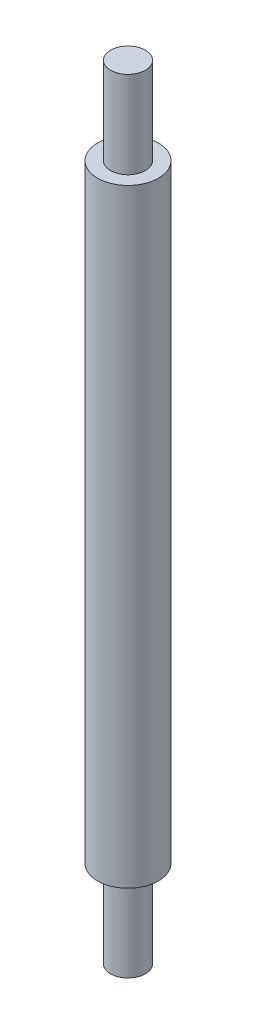
ISO-10303-21;
HEADER;
FILE_DESCRIPTION(('STEP AP214'),'2;1');
FILE_NAME('part.step','',(''),(''),'','','');
FILE_SCHEMA(('AUTOMOTIVE_DESIGN { 1 0 10303 214 1 1 1 1 }'));
ENDSEC;
DATA;
#1=APPLICATION_CONTEXT('core data for automotive mechanical design processes');
#2=APPLICATION_PROTOCOL_DEFINITION('international standard','automotive_design',2000,#1);
#3=PRODUCT_CONTEXT('',#1,'mechanical');
#4=PRODUCT('Part','Part','',(#3));
#5=PRODUCT_RELATED_PRODUCT_CATEGORY('part','',(#4));
#6=PRODUCT_DEFINITION_FORMATION('','',#4);
#7=PRODUCT_DEFINITION_CONTEXT('part definition',#1,'design');
#8=PRODUCT_DEFINITION('design','',#6,#7);
#9=PRODUCT_DEFINITION_SHAPE('','',#8);
#10=(LENGTH_UNIT() NAMED_UNIT(*) SI_UNIT(.MILLI.,.METRE.));
#11=(NAMED_UNIT(*) PLANE_ANGLE_UNIT() SI_UNIT($,.RADIAN.));
#12=(NAMED_UNIT(*) SI_UNIT($,.STERADIAN.) SOLID_ANGLE_UNIT());
#13=UNCERTAINTY_MEASURE_WITH_UNIT(LENGTH_MEASURE(1.E-05),#10,'distance_accuracy_value','');
#14=(GEOMETRIC_REPRESENTATION_CONTEXT(3) GLOBAL_UNCERTAINTY_ASSIGNED_CONTEXT((#13)) GLOBAL_UNIT_ASSIGNED_CONTEXT((#10,
#11,#12)) REPRESENTATION_CONTEXT('',''));
#15=CARTESIAN_POINT('',(0.,0.,0.));
#16=DIRECTION('',(0.,0.,1.));
#17=DIRECTION('',(1.,0.,0.));
#18=AXIS2_PLACEMENT_3D('',#15,#16,#17);
#19=CARTESIAN_POINT('',(0.,0.,0.));
#20=DIRECTION('',(0.,1.,0.));
#21=DIRECTION('',(0.,0.,1.));
#22=AXIS2_PLACEMENT_3D('',#19,#20,#21);
#23=PLANE('',#22);
#24=CARTESIAN_POINT('',(0.,0.,0.));
#25=DIRECTION('',(0.,1.,0.));
#26=DIRECTION('',(0.,0.,1.));
#27=AXIS2_PLACEMENT_3D('',#24,#25,#26);
#28=CIRCLE('',#27,3.5);
#29=CARTESIAN_POINT('',(0.,0.,3.5));
#30=VERTEX_POINT('',#29);
#31=EDGE_CURVE('E42',#30,#30,#28,.T.);
#32=ORIENTED_EDGE('',*,*,#31,.F.);
#33=EDGE_LOOP('',(#32));
#34=FACE_BOUND('',#33,.T.);
#35=CARTESIAN_POINT('',(0.,0.,0.));
#36=DIRECTION('',(0.,1.,0.));
#37=DIRECTION('',(0.,0.,1.));
#38=AXIS2_PLACEMENT_3D('',#35,#36,#37);
#39=CIRCLE('',#38,2.);
#40=CARTESIAN_POINT('',(0.,0.,2.));
#41=VERTEX_POINT('',#40);
#42=EDGE_CURVE('E10',#41,#41,#39,.F.);
#43=ORIENTED_EDGE('',*,*,#42,.F.);
#44=EDGE_LOOP('',(#43));
#45=FACE_BOUND('',#44,.T.);
#46=ADVANCED_FACE('F31',(#34,#45),#23,.F.);
#47=CARTESIAN_POINT('',(0.,70.,0.));
#48=DIRECTION('',(0.,1.,0.));
#49=DIRECTION('',(0.,0.,1.));
#50=AXIS2_PLACEMENT_3D('',#47,#48,#49);
#51=PLANE('',#50);
#52=CARTESIAN_POINT('',(0.,70.,0.));
#53=DIRECTION('',(0.,1.,0.));
#54=DIRECTION('',(0.,0.,1.));
#55=AXIS2_PLACEMENT_3D('',#52,#53,#54);
#56=CIRCLE('',#55,3.5);
#57=CARTESIAN_POINT('',(0.,70.,3.5));
#58=VERTEX_POINT('',#57);
#59=EDGE_CURVE('E38',#58,#58,#56,.T.);
#60=ORIENTED_EDGE('',*,*,#59,.T.);
#61=EDGE_LOOP('',(#60));
#62=FACE_BOUND('',#61,.T.);
#63=CARTESIAN_POINT('',(0.,70.,0.));
#64=DIRECTION('',(0.,1.,0.));
#65=DIRECTION('',(0.,0.,1.));
#66=AXIS2_PLACEMENT_3D('',#63,#64,#65);
#67=CIRCLE('',#66,2.);
#68=CARTESIAN_POINT('',(0.,70.,2.));
#69=VERTEX_POINT('',#68);
#70=EDGE_CURVE('E49',#69,#69,#67,.T.);
#71=ORIENTED_EDGE('',*,*,#70,.F.);
#72=EDGE_LOOP('',(#71));
#73=FACE_BOUND('',#72,.T.);
#74=ADVANCED_FACE('F73',(#62,#73),#51,.T.);
#75=CARTESIAN_POINT('',(0.,70.,0.));
#76=DIRECTION('',(0.,-1.,0.));
#77=DIRECTION('',(0.,0.,-1.));
#78=AXIS2_PLACEMENT_3D('',#75,#76,#77);
#79=CYLINDRICAL_SURFACE('',#78,3.5);
#80=ORIENTED_EDGE('',*,*,#59,.F.);
#81=EDGE_LOOP('',(#80));
#82=FACE_BOUND('',#81,.T.);
#83=ORIENTED_EDGE('',*,*,#31,.T.);
#84=EDGE_LOOP('',(#83));
#85=FACE_BOUND('',#84,.T.);
#86=ADVANCED_FACE('F33',(#82,#85),#79,.T.);
#87=CARTESIAN_POINT('',(0.,80.,0.));
#88=DIRECTION('',(0.,-1.,0.));
#89=DIRECTION('',(0.,0.,-1.));
#90=AXIS2_PLACEMENT_3D('',#87,#88,#89);
#91=CYLINDRICAL_SURFACE('',#90,2.);
#92=CARTESIAN_POINT('',(0.,80.,0.));
#93=DIRECTION('',(0.,1.,0.));
#94=DIRECTION('',(0.,0.,1.));
#95=AXIS2_PLACEMENT_3D('',#92,#93,#94);
#96=CIRCLE('',#95,2.);
#97=CARTESIAN_POINT('',(0.,80.,2.));
#98=VERTEX_POINT('',#97);
#99=EDGE_CURVE('E47',#98,#98,#96,.T.);
#100=ORIENTED_EDGE('',*,*,#99,.F.);
#101=EDGE_LOOP('',(#100));
#102=FACE_BOUND('',#101,.T.);
#103=ORIENTED_EDGE('',*,*,#70,.T.);
#104=EDGE_LOOP('',(#103));
#105=FACE_BOUND('',#104,.T.);
#106=ADVANCED_FACE('F69',(#102,#105),#91,.T.);
#107=CARTESIAN_POINT('',(0.,80.,0.));
#108=DIRECTION('',(0.,1.,0.));
#109=DIRECTION('',(0.,0.,1.));
#110=AXIS2_PLACEMENT_3D('',#107,#108,#109);
#111=PLANE('',#110);
#112=ORIENTED_EDGE('',*,*,#99,.T.);
#113=EDGE_LOOP('',(#112));
#114=FACE_BOUND('',#113,.T.);
#115=ADVANCED_FACE('F62',(#114),#111,.T.);
#116=CARTESIAN_POINT('',(0.,-10.,0.));
#117=DIRECTION('',(0.,1.,0.));
#118=DIRECTION('',(0.,0.,1.));
#119=AXIS2_PLACEMENT_3D('',#116,#117,#118);
#120=CYLINDRICAL_SURFACE('',#119,2.);
#121=CARTESIAN_POINT('',(0.,-10.,0.));
#122=DIRECTION('',(0.,-1.,0.));
#123=DIRECTION('',(0.,0.,-1.));
#124=AXIS2_PLACEMENT_3D('',#121,#122,#123);
#125=CIRCLE('',#124,2.);
#126=CARTESIAN_POINT('',(0.,-10.,-2.));
#127=VERTEX_POINT('',#126);
#128=EDGE_CURVE('E52',#127,#127,#125,.T.);
#129=ORIENTED_EDGE('',*,*,#128,.F.);
#130=EDGE_LOOP('',(#129));
#131=FACE_BOUND('',#130,.T.);
#132=ORIENTED_EDGE('',*,*,#42,.T.);
#133=EDGE_LOOP('',(#132));
#134=FACE_BOUND('',#133,.T.);
#135=ADVANCED_FACE('F60',(#131,#134),#120,.T.);
#136=CARTESIAN_POINT('',(0.,-10.,0.));
#137=DIRECTION('',(0.,-1.,0.));
#138=DIRECTION('',(0.,0.,-1.));
#139=AXIS2_PLACEMENT_3D('',#136,#137,#138);
#140=PLANE('',#139);
#141=ORIENTED_EDGE('',*,*,#128,.T.);
#142=EDGE_LOOP('',(#141));
#143=FACE_BOUND('',#142,.T.);
#144=ADVANCED_FACE('F58',(#143),#140,.T.);
#145=CLOSED_SHELL('',(#46,#74,#86,#106,#115,#135,#144));
#146=MANIFOLD_SOLID_BREP('B2',#145);
#147=ADVANCED_BREP_SHAPE_REPRESENTATION('',(#18,#146),#14);
#148=SHAPE_DEFINITION_REPRESENTATION(#9,#147);
ENDSEC;
END-ISO-10303-21;
